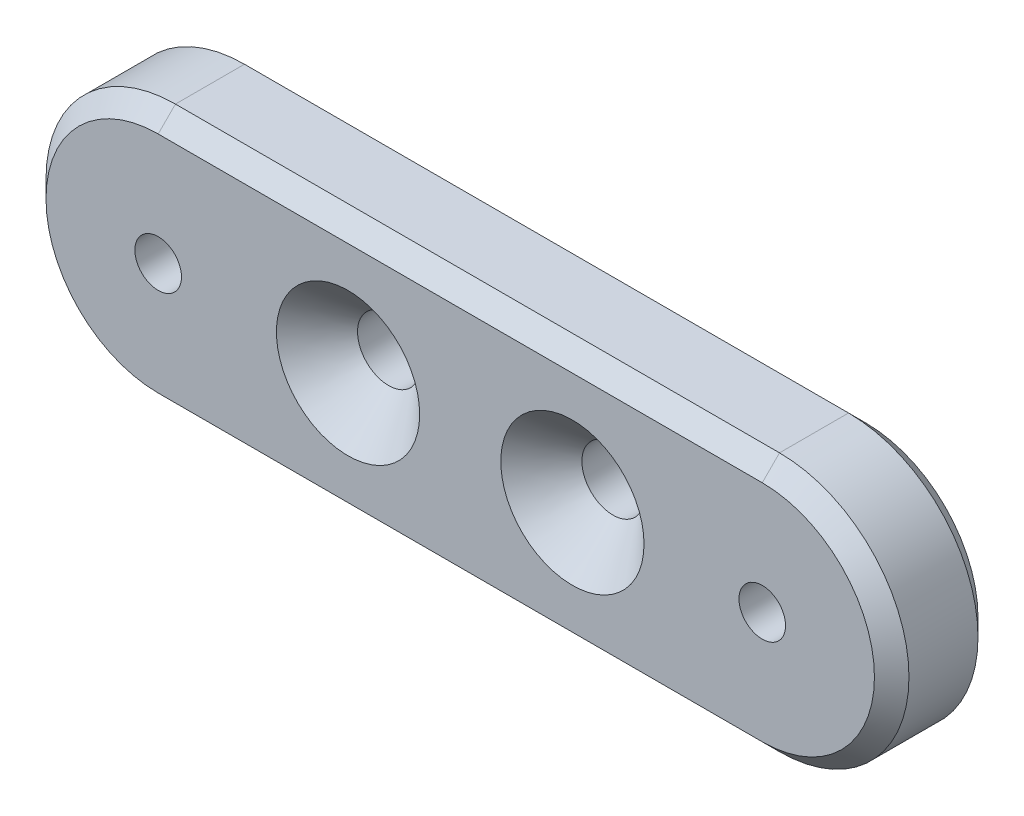
ISO-10303-21;
HEADER;
FILE_DESCRIPTION(('STEP AP214'),'2;1');
FILE_NAME('part.step','',(''),(''),'','','');
FILE_SCHEMA(('AUTOMOTIVE_DESIGN { 1 0 10303 214 1 1 1 1 }'));
ENDSEC;
DATA;
#1=APPLICATION_CONTEXT('core data for automotive mechanical design processes');
#2=APPLICATION_PROTOCOL_DEFINITION('international standard','automotive_design',2000,#1);
#3=PRODUCT_CONTEXT('',#1,'mechanical');
#4=PRODUCT('Part','Part','',(#3));
#5=PRODUCT_RELATED_PRODUCT_CATEGORY('part','',(#4));
#6=PRODUCT_DEFINITION_FORMATION('','',#4);
#7=PRODUCT_DEFINITION_CONTEXT('part definition',#1,'design');
#8=PRODUCT_DEFINITION('design','',#6,#7);
#9=PRODUCT_DEFINITION_SHAPE('','',#8);
#10=(LENGTH_UNIT() NAMED_UNIT(*) SI_UNIT(.MILLI.,.METRE.));
#11=(NAMED_UNIT(*) PLANE_ANGLE_UNIT() SI_UNIT($,.RADIAN.));
#12=(NAMED_UNIT(*) SI_UNIT($,.STERADIAN.) SOLID_ANGLE_UNIT());
#13=UNCERTAINTY_MEASURE_WITH_UNIT(LENGTH_MEASURE(1.E-05),#10,'distance_accuracy_value','');
#14=(GEOMETRIC_REPRESENTATION_CONTEXT(3) GLOBAL_UNCERTAINTY_ASSIGNED_CONTEXT((#13)) GLOBAL_UNIT_ASSIGNED_CONTEXT((#10,
#11,#12)) REPRESENTATION_CONTEXT('',''));
#15=CARTESIAN_POINT('',(0.,0.,0.));
#16=DIRECTION('',(0.,0.,1.));
#17=DIRECTION('',(1.,0.,0.));
#18=AXIS2_PLACEMENT_3D('',#15,#16,#17);
#19=CARTESIAN_POINT('',(-17.5,0.,6.));
#20=DIRECTION('',(0.,0.,1.));
#21=DIRECTION('',(1.,0.,0.));
#22=AXIS2_PLACEMENT_3D('',#19,#20,#21);
#23=PLANE('',#22);
#24=CARTESIAN_POINT('',(6.5,0.,6.));
#25=DIRECTION('',(0.,0.,1.));
#26=DIRECTION('',(1.,0.,0.));
#27=AXIS2_PLACEMENT_3D('',#24,#25,#26);
#28=CIRCLE('',#27,4.15);
#29=CARTESIAN_POINT('',(10.65,0.,6.));
#30=VERTEX_POINT('',#29);
#31=EDGE_CURVE('E404',#30,#30,#28,.T.);
#32=ORIENTED_EDGE('',*,*,#31,.F.);
#33=EDGE_LOOP('',(#32));
#34=FACE_BOUND('',#33,.T.);
#35=CARTESIAN_POINT('',(-6.5,0.,6.));
#36=DIRECTION('',(0.,0.,1.));
#37=DIRECTION('',(1.,0.,0.));
#38=AXIS2_PLACEMENT_3D('',#35,#36,#37);
#39=CIRCLE('',#38,4.15);
#40=CARTESIAN_POINT('',(-2.35,0.,6.));
#41=VERTEX_POINT('',#40);
#42=EDGE_CURVE('E417',#41,#41,#39,.T.);
#43=ORIENTED_EDGE('',*,*,#42,.F.);
#44=EDGE_LOOP('',(#43));
#45=FACE_BOUND('',#44,.T.);
#46=CARTESIAN_POINT('',(-17.5,0.,6.));
#47=DIRECTION('',(0.,0.,1.));
#48=DIRECTION('',(1.,0.,0.));
#49=AXIS2_PLACEMENT_3D('',#46,#47,#48);
#50=CIRCLE('',#49,6.5);
#51=CARTESIAN_POINT('',(-17.5,6.5,6.));
#52=VERTEX_POINT('',#51);
#53=CARTESIAN_POINT('',(-17.5,-6.5,6.));
#54=VERTEX_POINT('',#53);
#55=EDGE_CURVE('E56',#52,#54,#50,.T.);
#56=ORIENTED_EDGE('',*,*,#55,.T.);
#57=DIRECTION('',(1.,0.,0.));
#58=VECTOR('',#57,1.);
#59=CARTESIAN_POINT('',(17.5,-6.49999999999999,6.));
#60=LINE('',#59,#58);
#61=CARTESIAN_POINT('',(17.5,-6.5,6.));
#62=VERTEX_POINT('',#61);
#63=EDGE_CURVE('E11',#54,#62,#60,.T.);
#64=ORIENTED_EDGE('',*,*,#63,.T.);
#65=CARTESIAN_POINT('',(17.5,0.,6.));
#66=DIRECTION('',(0.,0.,1.));
#67=DIRECTION('',(1.,0.,0.));
#68=AXIS2_PLACEMENT_3D('',#65,#66,#67);
#69=CIRCLE('',#68,6.5);
#70=CARTESIAN_POINT('',(17.5,6.5,6.));
#71=VERTEX_POINT('',#70);
#72=EDGE_CURVE('E41',#62,#71,#69,.T.);
#73=ORIENTED_EDGE('',*,*,#72,.T.);
#74=DIRECTION('',(-1.,0.,0.));
#75=VECTOR('',#74,1.);
#76=CARTESIAN_POINT('',(-17.5,6.5,6.));
#77=LINE('',#76,#75);
#78=EDGE_CURVE('E200',#71,#52,#77,.T.);
#79=ORIENTED_EDGE('',*,*,#78,.T.);
#80=EDGE_LOOP('',(#56,#64,#73,#79));
#81=FACE_BOUND('',#80,.T.);
#82=CARTESIAN_POINT('',(-17.5,0.,6.));
#83=DIRECTION('',(0.,0.,1.));
#84=DIRECTION('',(1.,0.,0.));
#85=AXIS2_PLACEMENT_3D('',#82,#83,#84);
#86=CIRCLE('',#85,1.35);
#87=CARTESIAN_POINT('',(-16.15,0.,6.));
#88=VERTEX_POINT('',#87);
#89=EDGE_CURVE('E172',#88,#88,#86,.T.);
#90=ORIENTED_EDGE('',*,*,#89,.F.);
#91=EDGE_LOOP('',(#90));
#92=FACE_BOUND('',#91,.T.);
#93=CARTESIAN_POINT('',(17.5,0.,6.));
#94=DIRECTION('',(0.,0.,1.));
#95=DIRECTION('',(1.,0.,0.));
#96=AXIS2_PLACEMENT_3D('',#93,#94,#95);
#97=CIRCLE('',#96,1.35);
#98=CARTESIAN_POINT('',(18.85,0.,6.));
#99=VERTEX_POINT('',#98);
#100=EDGE_CURVE('E164',#99,#99,#97,.T.);
#101=ORIENTED_EDGE('',*,*,#100,.F.);
#102=EDGE_LOOP('',(#101));
#103=FACE_BOUND('',#102,.T.);
#104=ADVANCED_FACE('F32',(#34,#45,#81,#92,#103),#23,.T.);
#105=CARTESIAN_POINT('',(-17.5,0.,0.));
#106=DIRECTION('',(0.,0.,1.));
#107=DIRECTION('',(1.,0.,0.));
#108=AXIS2_PLACEMENT_3D('',#105,#106,#107);
#109=PLANE('',#108);
#110=CARTESIAN_POINT('',(6.5,0.,0.));
#111=DIRECTION('',(0.,0.,1.));
#112=DIRECTION('',(1.,0.,0.));
#113=AXIS2_PLACEMENT_3D('',#110,#111,#112);
#114=CIRCLE('',#113,1.825);
#115=CARTESIAN_POINT('',(8.325,0.,0.));
#116=VERTEX_POINT('',#115);
#117=EDGE_CURVE('E405',#116,#116,#114,.T.);
#118=ORIENTED_EDGE('',*,*,#117,.T.);
#119=EDGE_LOOP('',(#118));
#120=FACE_BOUND('',#119,.T.);
#121=CARTESIAN_POINT('',(-6.5,0.,0.));
#122=DIRECTION('',(0.,0.,1.));
#123=DIRECTION('',(1.,0.,0.));
#124=AXIS2_PLACEMENT_3D('',#121,#122,#123);
#125=CIRCLE('',#124,1.825);
#126=CARTESIAN_POINT('',(-4.675,0.,0.));
#127=VERTEX_POINT('',#126);
#128=EDGE_CURVE('E414',#127,#127,#125,.T.);
#129=ORIENTED_EDGE('',*,*,#128,.T.);
#130=EDGE_LOOP('',(#129));
#131=FACE_BOUND('',#130,.T.);
#132=CARTESIAN_POINT('',(17.5,0.,0.));
#133=DIRECTION('',(0.,0.,1.));
#134=DIRECTION('',(1.,0.,0.));
#135=AXIS2_PLACEMENT_3D('',#132,#133,#134);
#136=CIRCLE('',#135,6.49999999999999);
#137=CARTESIAN_POINT('',(17.5,6.5,0.));
#138=VERTEX_POINT('',#137);
#139=CARTESIAN_POINT('',(17.5,-6.49999999999999,0.));
#140=VERTEX_POINT('',#139);
#141=EDGE_CURVE('E187',#138,#140,#136,.F.);
#142=ORIENTED_EDGE('',*,*,#141,.T.);
#143=DIRECTION('',(-1.,0.,0.));
#144=VECTOR('',#143,1.);
#145=CARTESIAN_POINT('',(-17.5,-6.49999999999999,0.));
#146=LINE('',#145,#144);
#147=CARTESIAN_POINT('',(-17.5,-6.49999999999999,0.));
#148=VERTEX_POINT('',#147);
#149=EDGE_CURVE('E112',#140,#148,#146,.T.);
#150=ORIENTED_EDGE('',*,*,#149,.T.);
#151=CARTESIAN_POINT('',(-17.5,0.,0.));
#152=DIRECTION('',(0.,0.,1.));
#153=DIRECTION('',(1.,0.,0.));
#154=AXIS2_PLACEMENT_3D('',#151,#152,#153);
#155=CIRCLE('',#154,6.49999999999999);
#156=CARTESIAN_POINT('',(-17.5,6.49999999999999,0.));
#157=VERTEX_POINT('',#156);
#158=EDGE_CURVE('E185',#148,#157,#155,.F.);
#159=ORIENTED_EDGE('',*,*,#158,.T.);
#160=DIRECTION('',(1.,0.,0.));
#161=VECTOR('',#160,1.);
#162=CARTESIAN_POINT('',(-17.5,6.49999999999999,0.));
#163=LINE('',#162,#161);
#164=EDGE_CURVE('E183',#157,#138,#163,.T.);
#165=ORIENTED_EDGE('',*,*,#164,.T.);
#166=EDGE_LOOP('',(#142,#150,#159,#165));
#167=FACE_BOUND('',#166,.T.);
#168=CARTESIAN_POINT('',(-17.5,0.,0.));
#169=DIRECTION('',(0.,0.,1.));
#170=DIRECTION('',(1.,0.,0.));
#171=AXIS2_PLACEMENT_3D('',#168,#169,#170);
#172=CIRCLE('',#171,1.35);
#173=CARTESIAN_POINT('',(-16.15,0.,0.));
#174=VERTEX_POINT('',#173);
#175=EDGE_CURVE('E169',#174,#174,#172,.T.);
#176=ORIENTED_EDGE('',*,*,#175,.T.);
#177=EDGE_LOOP('',(#176));
#178=FACE_BOUND('',#177,.T.);
#179=CARTESIAN_POINT('',(17.5,0.,0.));
#180=DIRECTION('',(0.,0.,1.));
#181=DIRECTION('',(1.,0.,0.));
#182=AXIS2_PLACEMENT_3D('',#179,#180,#181);
#183=CIRCLE('',#182,1.35);
#184=CARTESIAN_POINT('',(18.85,0.,0.));
#185=VERTEX_POINT('',#184);
#186=EDGE_CURVE('E158',#185,#185,#183,.T.);
#187=ORIENTED_EDGE('',*,*,#186,.T.);
#188=EDGE_LOOP('',(#187));
#189=FACE_BOUND('',#188,.T.);
#190=ADVANCED_FACE('F229',(#120,#131,#167,#178,#189),#109,.F.);
#191=CARTESIAN_POINT('',(-17.5,0.,6.));
#192=DIRECTION('',(0.,0.,-1.));
#193=DIRECTION('',(-1.,0.,0.));
#194=AXIS2_PLACEMENT_3D('',#191,#192,#193);
#195=CYLINDRICAL_SURFACE('',#194,7.5);
#196=DIRECTION('',(0.,0.,-1.));
#197=VECTOR('',#196,1.);
#198=CARTESIAN_POINT('',(-17.5,7.5,6.));
#199=LINE('',#198,#197);
#200=CARTESIAN_POINT('',(-17.5,7.5,4.99999999999999));
#201=VERTEX_POINT('',#200);
#202=CARTESIAN_POINT('',(-17.5,7.5,1.));
#203=VERTEX_POINT('',#202);
#204=EDGE_CURVE('E175',#201,#203,#199,.T.);
#205=ORIENTED_EDGE('',*,*,#204,.T.);
#206=CARTESIAN_POINT('',(-17.5,0.,1.));
#207=DIRECTION('',(0.,0.,1.));
#208=DIRECTION('',(1.,0.,0.));
#209=AXIS2_PLACEMENT_3D('',#206,#207,#208);
#210=CIRCLE('',#209,7.5);
#211=CARTESIAN_POINT('',(-17.5,-7.5,1.));
#212=VERTEX_POINT('',#211);
#213=EDGE_CURVE('E194',#203,#212,#210,.T.);
#214=ORIENTED_EDGE('',*,*,#213,.T.);
#215=DIRECTION('',(0.,0.,-1.));
#216=VECTOR('',#215,1.);
#217=CARTESIAN_POINT('',(-17.5,-7.5,6.));
#218=LINE('',#217,#216);
#219=CARTESIAN_POINT('',(-17.5,-7.5,4.99999999999999));
#220=VERTEX_POINT('',#219);
#221=EDGE_CURVE('E123',#220,#212,#218,.T.);
#222=ORIENTED_EDGE('',*,*,#221,.F.);
#223=CARTESIAN_POINT('',(-17.5,0.,4.99999999999999));
#224=DIRECTION('',(0.,0.,1.));
#225=DIRECTION('',(1.,0.,0.));
#226=AXIS2_PLACEMENT_3D('',#223,#224,#225);
#227=CIRCLE('',#226,7.5);
#228=EDGE_CURVE('E192',#220,#201,#227,.F.);
#229=ORIENTED_EDGE('',*,*,#228,.T.);
#230=EDGE_LOOP('',(#205,#214,#222,#229));
#231=FACE_BOUND('',#230,.T.);
#232=ADVANCED_FACE('F209',(#231),#195,.T.);
#233=CARTESIAN_POINT('',(-17.5,-7.5,6.));
#234=DIRECTION('',(0.,1.,0.));
#235=DIRECTION('',(-1.,0.,0.));
#236=AXIS2_PLACEMENT_3D('',#233,#234,#235);
#237=PLANE('',#236);
#238=ORIENTED_EDGE('',*,*,#221,.T.);
#239=DIRECTION('',(1.,0.,0.));
#240=VECTOR('',#239,1.);
#241=CARTESIAN_POINT('',(-17.5,-7.5,1.));
#242=LINE('',#241,#240);
#243=CARTESIAN_POINT('',(17.5,-7.5,1.));
#244=VERTEX_POINT('',#243);
#245=EDGE_CURVE('E122',#212,#244,#242,.T.);
#246=ORIENTED_EDGE('',*,*,#245,.T.);
#247=DIRECTION('',(0.,0.,-1.));
#248=VECTOR('',#247,1.);
#249=CARTESIAN_POINT('',(17.5,-7.5,6.));
#250=LINE('',#249,#248);
#251=CARTESIAN_POINT('',(17.5,-7.5,4.99999999999999));
#252=VERTEX_POINT('',#251);
#253=EDGE_CURVE('E105',#252,#244,#250,.T.);
#254=ORIENTED_EDGE('',*,*,#253,.F.);
#255=DIRECTION('',(-1.,0.,0.));
#256=VECTOR('',#255,1.);
#257=CARTESIAN_POINT('',(-17.5,-7.5,4.99999999999999));
#258=LINE('',#257,#256);
#259=EDGE_CURVE('E119',#252,#220,#258,.T.);
#260=ORIENTED_EDGE('',*,*,#259,.T.);
#261=EDGE_LOOP('',(#238,#246,#254,#260));
#262=FACE_BOUND('',#261,.T.);
#263=ADVANCED_FACE('F118',(#262),#237,.F.);
#264=CARTESIAN_POINT('',(17.5,0.,6.));
#265=DIRECTION('',(0.,0.,-1.));
#266=DIRECTION('',(-1.,0.,0.));
#267=AXIS2_PLACEMENT_3D('',#264,#265,#266);
#268=CYLINDRICAL_SURFACE('',#267,7.5);
#269=ORIENTED_EDGE('',*,*,#253,.T.);
#270=CARTESIAN_POINT('',(17.5,0.,1.));
#271=DIRECTION('',(0.,0.,1.));
#272=DIRECTION('',(1.,0.,0.));
#273=AXIS2_PLACEMENT_3D('',#270,#271,#272);
#274=CIRCLE('',#273,7.5);
#275=CARTESIAN_POINT('',(17.5,7.50000000000001,1.));
#276=VERTEX_POINT('',#275);
#277=EDGE_CURVE('E111',#244,#276,#274,.T.);
#278=ORIENTED_EDGE('',*,*,#277,.T.);
#279=DIRECTION('',(0.,0.,-1.));
#280=VECTOR('',#279,1.);
#281=CARTESIAN_POINT('',(17.5,7.50000000000001,6.));
#282=LINE('',#281,#280);
#283=CARTESIAN_POINT('',(17.5,7.50000000000001,4.99999999999999));
#284=VERTEX_POINT('',#283);
#285=EDGE_CURVE('E107',#284,#276,#282,.T.);
#286=ORIENTED_EDGE('',*,*,#285,.F.);
#287=CARTESIAN_POINT('',(17.5,0.,4.99999999999999));
#288=DIRECTION('',(0.,0.,1.));
#289=DIRECTION('',(1.,0.,0.));
#290=AXIS2_PLACEMENT_3D('',#287,#288,#289);
#291=CIRCLE('',#290,7.5);
#292=EDGE_CURVE('E102',#284,#252,#291,.F.);
#293=ORIENTED_EDGE('',*,*,#292,.T.);
#294=EDGE_LOOP('',(#269,#278,#286,#293));
#295=FACE_BOUND('',#294,.T.);
#296=ADVANCED_FACE('F104',(#295),#268,.T.);
#297=CARTESIAN_POINT('',(-17.5,7.5,6.));
#298=DIRECTION('',(0.,-1.,0.));
#299=DIRECTION('',(1.,0.,0.));
#300=AXIS2_PLACEMENT_3D('',#297,#298,#299);
#301=PLANE('',#300);
#302=ORIENTED_EDGE('',*,*,#285,.T.);
#303=DIRECTION('',(-1.,0.,0.));
#304=VECTOR('',#303,1.);
#305=CARTESIAN_POINT('',(-17.5,7.5,1.));
#306=LINE('',#305,#304);
#307=EDGE_CURVE('E198',#276,#203,#306,.T.);
#308=ORIENTED_EDGE('',*,*,#307,.T.);
#309=ORIENTED_EDGE('',*,*,#204,.F.);
#310=DIRECTION('',(1.,0.,0.));
#311=VECTOR('',#310,1.);
#312=CARTESIAN_POINT('',(17.5,7.50000000000001,4.99999999999999));
#313=LINE('',#312,#311);
#314=EDGE_CURVE('E196',#201,#284,#313,.T.);
#315=ORIENTED_EDGE('',*,*,#314,.T.);
#316=EDGE_LOOP('',(#302,#308,#309,#315));
#317=FACE_BOUND('',#316,.T.);
#318=ADVANCED_FACE('F211',(#317),#301,.F.);
#319=CARTESIAN_POINT('',(-17.5,0.,6.));
#320=DIRECTION('',(0.,0.,-1.));
#321=DIRECTION('',(-1.,0.,0.));
#322=AXIS2_PLACEMENT_3D('',#319,#320,#321);
#323=CYLINDRICAL_SURFACE('',#322,1.35);
#324=ORIENTED_EDGE('',*,*,#89,.T.);
#325=EDGE_LOOP('',(#324));
#326=FACE_BOUND('',#325,.T.);
#327=ORIENTED_EDGE('',*,*,#175,.F.);
#328=EDGE_LOOP('',(#327));
#329=FACE_BOUND('',#328,.T.);
#330=ADVANCED_FACE('F240',(#326,#329),#323,.F.);
#331=CARTESIAN_POINT('',(17.5,0.,6.));
#332=DIRECTION('',(0.,0.,-1.));
#333=DIRECTION('',(-1.,0.,0.));
#334=AXIS2_PLACEMENT_3D('',#331,#332,#333);
#335=CYLINDRICAL_SURFACE('',#334,1.35);
#336=ORIENTED_EDGE('',*,*,#100,.T.);
#337=EDGE_LOOP('',(#336));
#338=FACE_BOUND('',#337,.T.);
#339=ORIENTED_EDGE('',*,*,#186,.F.);
#340=EDGE_LOOP('',(#339));
#341=FACE_BOUND('',#340,.T.);
#342=ADVANCED_FACE('F273',(#338,#341),#335,.F.);
#343=CARTESIAN_POINT('',(-17.5,7.5,1.));
#344=DIRECTION('',(0.,-0.707106781186545,0.70710678118655));
#345=DIRECTION('',(-1.,0.,0.));
#346=AXIS2_PLACEMENT_3D('',#343,#344,#345);
#347=PLANE('',#346);
#348=DIRECTION('',(0.,0.70710678118655,0.707106781186545));
#349=VECTOR('',#348,1.);
#350=CARTESIAN_POINT('',(17.5,6.5,0.));
#351=LINE('',#350,#349);
#352=EDGE_CURVE('E150',#138,#276,#351,.T.);
#353=ORIENTED_EDGE('',*,*,#352,.F.);
#354=ORIENTED_EDGE('',*,*,#164,.F.);
#355=DIRECTION('',(0.,-0.70710678118655,-0.707106781186545));
#356=VECTOR('',#355,1.);
#357=CARTESIAN_POINT('',(-17.5,7.5,1.));
#358=LINE('',#357,#356);
#359=EDGE_CURVE('E138',#203,#157,#358,.T.);
#360=ORIENTED_EDGE('',*,*,#359,.F.);
#361=ORIENTED_EDGE('',*,*,#307,.F.);
#362=EDGE_LOOP('',(#353,#354,#360,#361));
#363=FACE_BOUND('',#362,.T.);
#364=ADVANCED_FACE('F214',(#363),#347,.F.);
#365=CARTESIAN_POINT('',(-17.5,0.,1.));
#366=DIRECTION('',(0.,0.,1.));
#367=DIRECTION('',(1.,0.,0.));
#368=AXIS2_PLACEMENT_3D('',#365,#366,#367);
#369=CONICAL_SURFACE('',#368,7.5,0.785398163397452);
#370=ORIENTED_EDGE('',*,*,#359,.T.);
#371=ORIENTED_EDGE('',*,*,#158,.F.);
#372=DIRECTION('',(0.,0.70710678118655,-0.707106781186545));
#373=VECTOR('',#372,1.);
#374=CARTESIAN_POINT('',(-17.5,-7.5,1.));
#375=LINE('',#374,#373);
#376=EDGE_CURVE('E144',#212,#148,#375,.T.);
#377=ORIENTED_EDGE('',*,*,#376,.F.);
#378=ORIENTED_EDGE('',*,*,#213,.F.);
#379=EDGE_LOOP('',(#370,#371,#377,#378));
#380=FACE_BOUND('',#379,.T.);
#381=ADVANCED_FACE('F217',(#380),#369,.T.);
#382=CARTESIAN_POINT('',(17.5,0.,1.));
#383=DIRECTION('',(0.,0.,1.));
#384=DIRECTION('',(1.,0.,0.));
#385=AXIS2_PLACEMENT_3D('',#382,#383,#384);
#386=CONICAL_SURFACE('',#385,7.5,0.785398163397452);
#387=ORIENTED_EDGE('',*,*,#352,.T.);
#388=ORIENTED_EDGE('',*,*,#277,.F.);
#389=DIRECTION('',(0.,-0.70710678118655,0.707106781186545));
#390=VECTOR('',#389,1.);
#391=CARTESIAN_POINT('',(17.5,-6.49999999999999,0.));
#392=LINE('',#391,#390);
#393=EDGE_CURVE('E141',#140,#244,#392,.T.);
#394=ORIENTED_EDGE('',*,*,#393,.F.);
#395=ORIENTED_EDGE('',*,*,#141,.F.);
#396=EDGE_LOOP('',(#387,#388,#394,#395));
#397=FACE_BOUND('',#396,.T.);
#398=ADVANCED_FACE('F220',(#397),#386,.T.);
#399=CARTESIAN_POINT('',(-17.5,-7.5,1.));
#400=DIRECTION('',(0.,0.707106781186545,0.70710678118655));
#401=DIRECTION('',(1.,0.,0.));
#402=AXIS2_PLACEMENT_3D('',#399,#400,#401);
#403=PLANE('',#402);
#404=ORIENTED_EDGE('',*,*,#376,.T.);
#405=ORIENTED_EDGE('',*,*,#149,.F.);
#406=ORIENTED_EDGE('',*,*,#393,.T.);
#407=ORIENTED_EDGE('',*,*,#245,.F.);
#408=EDGE_LOOP('',(#404,#405,#406,#407));
#409=FACE_BOUND('',#408,.T.);
#410=ADVANCED_FACE('F218',(#409),#403,.F.);
#411=CARTESIAN_POINT('',(-17.5,6.5,6.));
#412=DIRECTION('',(0.,0.70710678118655,0.707106781186545));
#413=DIRECTION('',(1.,0.,0.));
#414=AXIS2_PLACEMENT_3D('',#411,#412,#413);
#415=PLANE('',#414);
#416=DIRECTION('',(0.,-0.707106781186545,0.70710678118655));
#417=VECTOR('',#416,1.);
#418=CARTESIAN_POINT('',(17.5,7.50000000000001,4.99999999999999));
#419=LINE('',#418,#417);
#420=EDGE_CURVE('E132',#284,#71,#419,.T.);
#421=ORIENTED_EDGE('',*,*,#420,.F.);
#422=ORIENTED_EDGE('',*,*,#314,.F.);
#423=DIRECTION('',(0.,0.707106781186545,-0.70710678118655));
#424=VECTOR('',#423,1.);
#425=CARTESIAN_POINT('',(-17.5,6.5,6.));
#426=LINE('',#425,#424);
#427=EDGE_CURVE('E36',#52,#201,#426,.T.);
#428=ORIENTED_EDGE('',*,*,#427,.F.);
#429=ORIENTED_EDGE('',*,*,#78,.F.);
#430=EDGE_LOOP('',(#421,#422,#428,#429));
#431=FACE_BOUND('',#430,.T.);
#432=ADVANCED_FACE('F34',(#431),#415,.T.);
#433=CARTESIAN_POINT('',(-17.5,0.,6.));
#434=DIRECTION('',(0.,0.,-1.));
#435=DIRECTION('',(-1.,0.,0.));
#436=AXIS2_PLACEMENT_3D('',#433,#434,#435);
#437=CONICAL_SURFACE('',#436,6.5,0.785398163397445);
#438=ORIENTED_EDGE('',*,*,#427,.T.);
#439=ORIENTED_EDGE('',*,*,#228,.F.);
#440=DIRECTION('',(0.,-0.707106781186545,-0.70710678118655));
#441=VECTOR('',#440,1.);
#442=CARTESIAN_POINT('',(-17.5,-6.5,6.));
#443=LINE('',#442,#441);
#444=EDGE_CURVE('E126',#54,#220,#443,.T.);
#445=ORIENTED_EDGE('',*,*,#444,.F.);
#446=ORIENTED_EDGE('',*,*,#55,.F.);
#447=EDGE_LOOP('',(#438,#439,#445,#446));
#448=FACE_BOUND('',#447,.T.);
#449=ADVANCED_FACE('F206',(#448),#437,.T.);
#450=CARTESIAN_POINT('',(17.5,0.,6.));
#451=DIRECTION('',(0.,0.,-1.));
#452=DIRECTION('',(-1.,0.,0.));
#453=AXIS2_PLACEMENT_3D('',#450,#451,#452);
#454=CONICAL_SURFACE('',#453,6.5,0.785398163397445);
#455=ORIENTED_EDGE('',*,*,#420,.T.);
#456=ORIENTED_EDGE('',*,*,#72,.F.);
#457=DIRECTION('',(0.,0.707106781186545,0.70710678118655));
#458=VECTOR('',#457,1.);
#459=CARTESIAN_POINT('',(17.5,-7.5,4.99999999999999));
#460=LINE('',#459,#458);
#461=EDGE_CURVE('E49',#252,#62,#460,.T.);
#462=ORIENTED_EDGE('',*,*,#461,.F.);
#463=ORIENTED_EDGE('',*,*,#292,.F.);
#464=EDGE_LOOP('',(#455,#456,#462,#463));
#465=FACE_BOUND('',#464,.T.);
#466=ADVANCED_FACE('F129',(#465),#454,.T.);
#467=CARTESIAN_POINT('',(-17.5,-6.5,6.));
#468=DIRECTION('',(0.,-0.70710678118655,0.707106781186545));
#469=DIRECTION('',(-1.,0.,0.));
#470=AXIS2_PLACEMENT_3D('',#467,#468,#469);
#471=PLANE('',#470);
#472=ORIENTED_EDGE('',*,*,#444,.T.);
#473=ORIENTED_EDGE('',*,*,#259,.F.);
#474=ORIENTED_EDGE('',*,*,#461,.T.);
#475=ORIENTED_EDGE('',*,*,#63,.F.);
#476=EDGE_LOOP('',(#472,#473,#474,#475));
#477=FACE_BOUND('',#476,.T.);
#478=ADVANCED_FACE('F125',(#477),#471,.T.);
#479=CARTESIAN_POINT('',(-6.5,0.,0.0250000000000059));
#480=DIRECTION('',(0.,0.,-1.));
#481=DIRECTION('',(-1.,0.,0.));
#482=AXIS2_PLACEMENT_3D('',#479,#480,#481);
#483=CONICAL_SURFACE('',#482,1.79999999999999,0.785398163397448);
#484=ORIENTED_EDGE('',*,*,#128,.F.);
#485=EDGE_LOOP('',(#484));
#486=FACE_BOUND('',#485,.T.);
#487=CARTESIAN_POINT('',(-6.5,0.,0.0250000000000059));
#488=DIRECTION('',(0.,0.,1.));
#489=DIRECTION('',(1.,0.,0.));
#490=AXIS2_PLACEMENT_3D('',#487,#488,#489);
#491=CIRCLE('',#490,1.79999999999999);
#492=CARTESIAN_POINT('',(-4.70000000000001,0.,0.0250000000000059));
#493=VERTEX_POINT('',#492);
#494=EDGE_CURVE('E130',#493,#493,#491,.T.);
#495=ORIENTED_EDGE('',*,*,#494,.T.);
#496=EDGE_LOOP('',(#495));
#497=FACE_BOUND('',#496,.T.);
#498=ADVANCED_FACE('F327',(#486,#497),#483,.F.);
#499=CARTESIAN_POINT('',(-6.5,0.,6.));
#500=DIRECTION('',(0.,0.,1.));
#501=DIRECTION('',(1.,0.,0.));
#502=AXIS2_PLACEMENT_3D('',#499,#500,#501);
#503=CYLINDRICAL_SURFACE('',#502,1.79999999999999);
#504=ORIENTED_EDGE('',*,*,#494,.F.);
#505=EDGE_LOOP('',(#504));
#506=FACE_BOUND('',#505,.T.);
#507=CARTESIAN_POINT('',(-6.5,0.,3.64999999999998));
#508=DIRECTION('',(0.,0.,1.));
#509=DIRECTION('',(1.,0.,0.));
#510=AXIS2_PLACEMENT_3D('',#507,#508,#509);
#511=CIRCLE('',#510,1.79999999999999);
#512=CARTESIAN_POINT('',(-4.70000000000002,0.,3.64999999999998));
#513=VERTEX_POINT('',#512);
#514=EDGE_CURVE('E135',#513,#513,#511,.T.);
#515=ORIENTED_EDGE('',*,*,#514,.T.);
#516=EDGE_LOOP('',(#515));
#517=FACE_BOUND('',#516,.T.);
#518=ADVANCED_FACE('F345',(#506,#517),#503,.F.);
#519=CARTESIAN_POINT('',(-6.5,0.,6.));
#520=DIRECTION('',(0.,0.,1.));
#521=DIRECTION('',(1.,0.,0.));
#522=AXIS2_PLACEMENT_3D('',#519,#520,#521);
#523=CONICAL_SURFACE('',#522,4.15,0.785398163397447);
#524=ORIENTED_EDGE('',*,*,#514,.F.);
#525=EDGE_LOOP('',(#524));
#526=FACE_BOUND('',#525,.T.);
#527=ORIENTED_EDGE('',*,*,#42,.T.);
#528=EDGE_LOOP('',(#527));
#529=FACE_BOUND('',#528,.T.);
#530=ADVANCED_FACE('F355',(#526,#529),#523,.F.);
#531=CARTESIAN_POINT('',(6.5,0.,0.0250000000000059));
#532=DIRECTION('',(0.,0.,-1.));
#533=DIRECTION('',(-1.,0.,0.));
#534=AXIS2_PLACEMENT_3D('',#531,#532,#533);
#535=CONICAL_SURFACE('',#534,1.79999999999999,0.785398163397448);
#536=ORIENTED_EDGE('',*,*,#117,.F.);
#537=EDGE_LOOP('',(#536));
#538=FACE_BOUND('',#537,.T.);
#539=CARTESIAN_POINT('',(6.5,0.,0.0250000000000059));
#540=DIRECTION('',(0.,0.,1.));
#541=DIRECTION('',(1.,0.,0.));
#542=AXIS2_PLACEMENT_3D('',#539,#540,#541);
#543=CIRCLE('',#542,1.79999999999999);
#544=CARTESIAN_POINT('',(8.3,0.,0.0250000000000059));
#545=VERTEX_POINT('',#544);
#546=EDGE_CURVE('E407',#545,#545,#543,.T.);
#547=ORIENTED_EDGE('',*,*,#546,.T.);
#548=EDGE_LOOP('',(#547));
#549=FACE_BOUND('',#548,.T.);
#550=ADVANCED_FACE('F365',(#538,#549),#535,.F.);
#551=CARTESIAN_POINT('',(6.5,0.,6.));
#552=DIRECTION('',(0.,0.,1.));
#553=DIRECTION('',(1.,0.,0.));
#554=AXIS2_PLACEMENT_3D('',#551,#552,#553);
#555=CYLINDRICAL_SURFACE('',#554,1.79999999999999);
#556=ORIENTED_EDGE('',*,*,#546,.F.);
#557=EDGE_LOOP('',(#556));
#558=FACE_BOUND('',#557,.T.);
#559=CARTESIAN_POINT('',(6.5,0.,3.64999999999998));
#560=DIRECTION('',(0.,0.,1.));
#561=DIRECTION('',(1.,0.,0.));
#562=AXIS2_PLACEMENT_3D('',#559,#560,#561);
#563=CIRCLE('',#562,1.79999999999999);
#564=CARTESIAN_POINT('',(8.29999999999999,0.,3.64999999999998));
#565=VERTEX_POINT('',#564);
#566=EDGE_CURVE('E402',#565,#565,#563,.T.);
#567=ORIENTED_EDGE('',*,*,#566,.T.);
#568=EDGE_LOOP('',(#567));
#569=FACE_BOUND('',#568,.T.);
#570=ADVANCED_FACE('F375',(#558,#569),#555,.F.);
#571=CARTESIAN_POINT('',(6.5,0.,6.));
#572=DIRECTION('',(0.,0.,1.));
#573=DIRECTION('',(1.,0.,0.));
#574=AXIS2_PLACEMENT_3D('',#571,#572,#573);
#575=CONICAL_SURFACE('',#574,4.15,0.785398163397447);
#576=ORIENTED_EDGE('',*,*,#566,.F.);
#577=EDGE_LOOP('',(#576));
#578=FACE_BOUND('',#577,.T.);
#579=ORIENTED_EDGE('',*,*,#31,.T.);
#580=EDGE_LOOP('',(#579));
#581=FACE_BOUND('',#580,.T.);
#582=ADVANCED_FACE('F385',(#578,#581),#575,.F.);
#583=CLOSED_SHELL('',(#104,#190,#232,#263,#296,#318,#330,#342,#364,#381,#398,#410,#432,#449,
#466,#478,#498,#518,#530,#550,#570,#582));
#584=MANIFOLD_SOLID_BREP('B2',#583);
#585=ADVANCED_BREP_SHAPE_REPRESENTATION('',(#18,#584),#14);
#586=SHAPE_DEFINITION_REPRESENTATION(#9,#585);
ENDSEC;
END-ISO-10303-21;
